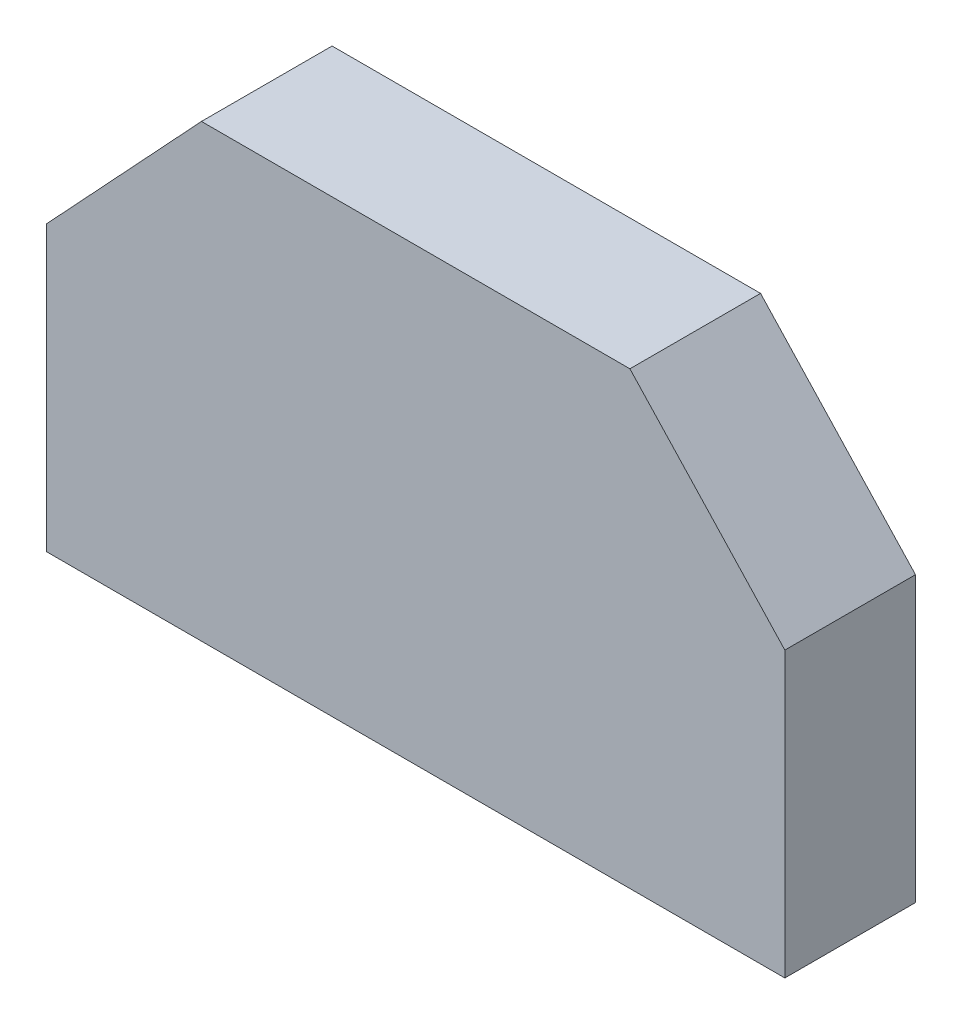
ISO-10303-21;
HEADER;
FILE_DESCRIPTION(('STEP AP214'),'2;1');
FILE_NAME('part.step','',(''),(''),'','','');
FILE_SCHEMA(('AUTOMOTIVE_DESIGN { 1 0 10303 214 1 1 1 1 }'));
ENDSEC;
DATA;
#1=APPLICATION_CONTEXT('core data for automotive mechanical design processes');
#2=APPLICATION_PROTOCOL_DEFINITION('international standard','automotive_design',2000,#1);
#3=PRODUCT_CONTEXT('',#1,'mechanical');
#4=PRODUCT('Part','Part','',(#3));
#5=PRODUCT_RELATED_PRODUCT_CATEGORY('part','',(#4));
#6=PRODUCT_DEFINITION_FORMATION('','',#4);
#7=PRODUCT_DEFINITION_CONTEXT('part definition',#1,'design');
#8=PRODUCT_DEFINITION('design','',#6,#7);
#9=PRODUCT_DEFINITION_SHAPE('','',#8);
#10=(LENGTH_UNIT() NAMED_UNIT(*) SI_UNIT(.MILLI.,.METRE.));
#11=(NAMED_UNIT(*) PLANE_ANGLE_UNIT() SI_UNIT($,.RADIAN.));
#12=(NAMED_UNIT(*) SI_UNIT($,.STERADIAN.) SOLID_ANGLE_UNIT());
#13=UNCERTAINTY_MEASURE_WITH_UNIT(LENGTH_MEASURE(1.E-05),#10,'distance_accuracy_value','');
#14=(GEOMETRIC_REPRESENTATION_CONTEXT(3) GLOBAL_UNCERTAINTY_ASSIGNED_CONTEXT((#13)) GLOBAL_UNIT_ASSIGNED_CONTEXT((#10,
#11,#12)) REPRESENTATION_CONTEXT('',''));
#15=CARTESIAN_POINT('',(0.,0.,0.));
#16=DIRECTION('',(0.,0.,1.));
#17=DIRECTION('',(1.,0.,0.));
#18=AXIS2_PLACEMENT_3D('',#15,#16,#17);
#19=CARTESIAN_POINT('',(-165.1,0.,29.21));
#20=DIRECTION('',(1.,0.,0.));
#21=DIRECTION('',(0.,0.,-1.));
#22=AXIS2_PLACEMENT_3D('',#19,#20,#21);
#23=PLANE('',#22);
#24=DIRECTION('',(0.,-1.,0.));
#25=VECTOR('',#24,1.);
#26=CARTESIAN_POINT('',(-165.1,0.,-29.21));
#27=LINE('',#26,#25);
#28=CARTESIAN_POINT('',(-165.1,127.,-29.21));
#29=VERTEX_POINT('',#28);
#30=CARTESIAN_POINT('',(-165.1,0.,-29.21));
#31=VERTEX_POINT('',#30);
#32=EDGE_CURVE('E132',#29,#31,#27,.T.);
#33=ORIENTED_EDGE('',*,*,#32,.T.);
#34=DIRECTION('',(0.,0.,-1.));
#35=VECTOR('',#34,1.);
#36=CARTESIAN_POINT('',(-165.1,0.,29.21));
#37=LINE('',#36,#35);
#38=CARTESIAN_POINT('',(-165.1,0.,29.21));
#39=VERTEX_POINT('',#38);
#40=EDGE_CURVE('E11',#39,#31,#37,.T.);
#41=ORIENTED_EDGE('',*,*,#40,.F.);
#42=DIRECTION('',(0.,-1.,0.));
#43=VECTOR('',#42,1.);
#44=CARTESIAN_POINT('',(-165.1,0.,29.21));
#45=LINE('',#44,#43);
#46=CARTESIAN_POINT('',(-165.1,127.,29.21));
#47=VERTEX_POINT('',#46);
#48=EDGE_CURVE('E148',#47,#39,#45,.T.);
#49=ORIENTED_EDGE('',*,*,#48,.F.);
#50=DIRECTION('',(0.,0.,-1.));
#51=VECTOR('',#50,1.);
#52=CARTESIAN_POINT('',(-165.1,127.,29.21));
#53=LINE('',#52,#51);
#54=EDGE_CURVE('E128',#47,#29,#53,.T.);
#55=ORIENTED_EDGE('',*,*,#54,.T.);
#56=EDGE_LOOP('',(#33,#41,#49,#55));
#57=FACE_BOUND('',#56,.T.);
#58=ADVANCED_FACE('F43',(#57),#23,.F.);
#59=CARTESIAN_POINT('',(-165.1,0.,29.21));
#60=DIRECTION('',(0.,1.,0.));
#61=DIRECTION('',(-1.,0.,0.));
#62=AXIS2_PLACEMENT_3D('',#59,#60,#61);
#63=PLANE('',#62);
#64=DIRECTION('',(1.,0.,0.));
#65=VECTOR('',#64,1.);
#66=CARTESIAN_POINT('',(-165.1,0.,-29.21));
#67=LINE('',#66,#65);
#68=CARTESIAN_POINT('',(165.1,0.,-29.21));
#69=VERTEX_POINT('',#68);
#70=EDGE_CURVE('E136',#31,#69,#67,.T.);
#71=ORIENTED_EDGE('',*,*,#70,.T.);
#72=DIRECTION('',(0.,0.,-1.));
#73=VECTOR('',#72,1.);
#74=CARTESIAN_POINT('',(165.1,0.,29.21));
#75=LINE('',#74,#73);
#76=CARTESIAN_POINT('',(165.1,0.,29.21));
#77=VERTEX_POINT('',#76);
#78=EDGE_CURVE('E52',#77,#69,#75,.T.);
#79=ORIENTED_EDGE('',*,*,#78,.F.);
#80=DIRECTION('',(1.,0.,0.));
#81=VECTOR('',#80,1.);
#82=CARTESIAN_POINT('',(-165.1,0.,29.21));
#83=LINE('',#82,#81);
#84=EDGE_CURVE('E97',#39,#77,#83,.T.);
#85=ORIENTED_EDGE('',*,*,#84,.F.);
#86=ORIENTED_EDGE('',*,*,#40,.T.);
#87=EDGE_LOOP('',(#71,#79,#85,#86));
#88=FACE_BOUND('',#87,.T.);
#89=ADVANCED_FACE('F176',(#88),#63,.F.);
#90=CARTESIAN_POINT('',(165.1,0.,29.21));
#91=DIRECTION('',(-1.,0.,0.));
#92=DIRECTION('',(0.,0.,1.));
#93=AXIS2_PLACEMENT_3D('',#90,#91,#92);
#94=PLANE('',#93);
#95=DIRECTION('',(0.,1.,0.));
#96=VECTOR('',#95,1.);
#97=CARTESIAN_POINT('',(165.1,0.,-29.21));
#98=LINE('',#97,#96);
#99=CARTESIAN_POINT('',(165.1,127.,-29.21));
#100=VERTEX_POINT('',#99);
#101=EDGE_CURVE('E139',#69,#100,#98,.T.);
#102=ORIENTED_EDGE('',*,*,#101,.T.);
#103=DIRECTION('',(0.,0.,-1.));
#104=VECTOR('',#103,1.);
#105=CARTESIAN_POINT('',(165.1,127.,29.21));
#106=LINE('',#105,#104);
#107=CARTESIAN_POINT('',(165.1,127.,29.21));
#108=VERTEX_POINT('',#107);
#109=EDGE_CURVE('E121',#108,#100,#106,.T.);
#110=ORIENTED_EDGE('',*,*,#109,.F.);
#111=DIRECTION('',(0.,1.,0.));
#112=VECTOR('',#111,1.);
#113=CARTESIAN_POINT('',(165.1,0.,29.21));
#114=LINE('',#113,#112);
#115=EDGE_CURVE('E110',#77,#108,#114,.T.);
#116=ORIENTED_EDGE('',*,*,#115,.F.);
#117=ORIENTED_EDGE('',*,*,#78,.T.);
#118=EDGE_LOOP('',(#102,#110,#116,#117));
#119=FACE_BOUND('',#118,.T.);
#120=ADVANCED_FACE('F158',(#119),#94,.F.);
#121=CARTESIAN_POINT('',(165.1,127.,29.21));
#122=DIRECTION('',(-0.731353701619169,-0.681998360062499,0.));
#123=DIRECTION('',(0.6819983600625,-0.731353701619169,0.));
#124=AXIS2_PLACEMENT_3D('',#121,#122,#123);
#125=PLANE('',#124);
#126=DIRECTION('',(-0.681998360062499,0.731353701619169,0.));
#127=VECTOR('',#126,1.);
#128=CARTESIAN_POINT('',(165.1,127.,-29.21));
#129=LINE('',#128,#127);
#130=CARTESIAN_POINT('',(95.80896661765,201.305536084508,-29.21));
#131=VERTEX_POINT('',#130);
#132=EDGE_CURVE('E119',#100,#131,#129,.T.);
#133=ORIENTED_EDGE('',*,*,#132,.T.);
#134=DIRECTION('',(0.,0.,-1.));
#135=VECTOR('',#134,1.);
#136=CARTESIAN_POINT('',(95.80896661765,201.305536084508,29.21));
#137=LINE('',#136,#135);
#138=CARTESIAN_POINT('',(95.80896661765,201.305536084508,29.21));
#139=VERTEX_POINT('',#138);
#140=EDGE_CURVE('E116',#139,#131,#137,.T.);
#141=ORIENTED_EDGE('',*,*,#140,.F.);
#142=DIRECTION('',(-0.681998360062499,0.731353701619169,0.));
#143=VECTOR('',#142,1.);
#144=CARTESIAN_POINT('',(165.1,127.,29.21));
#145=LINE('',#144,#143);
#146=EDGE_CURVE('E104',#108,#139,#145,.T.);
#147=ORIENTED_EDGE('',*,*,#146,.F.);
#148=ORIENTED_EDGE('',*,*,#109,.T.);
#149=EDGE_LOOP('',(#133,#141,#147,#148));
#150=FACE_BOUND('',#149,.T.);
#151=ADVANCED_FACE('F117',(#150),#125,.F.);
#152=CARTESIAN_POINT('',(-95.80896661765,201.305536084508,29.21));
#153=DIRECTION('',(0.,-1.,0.));
#154=DIRECTION('',(0.,0.,-1.));
#155=AXIS2_PLACEMENT_3D('',#152,#153,#154);
#156=PLANE('',#155);
#157=DIRECTION('',(-1.,0.,0.));
#158=VECTOR('',#157,1.);
#159=CARTESIAN_POINT('',(-95.80896661765,201.305536084508,-29.21));
#160=LINE('',#159,#158);
#161=CARTESIAN_POINT('',(-95.80896661765,201.305536084508,-29.21));
#162=VERTEX_POINT('',#161);
#163=EDGE_CURVE('E83',#131,#162,#160,.T.);
#164=ORIENTED_EDGE('',*,*,#163,.T.);
#165=DIRECTION('',(0.,0.,-1.));
#166=VECTOR('',#165,1.);
#167=CARTESIAN_POINT('',(-95.80896661765,201.305536084508,29.21));
#168=LINE('',#167,#166);
#169=CARTESIAN_POINT('',(-95.80896661765,201.305536084508,29.21));
#170=VERTEX_POINT('',#169);
#171=EDGE_CURVE('E122',#170,#162,#168,.T.);
#172=ORIENTED_EDGE('',*,*,#171,.F.);
#173=DIRECTION('',(-1.,0.,0.));
#174=VECTOR('',#173,1.);
#175=CARTESIAN_POINT('',(-95.80896661765,201.305536084508,29.21));
#176=LINE('',#175,#174);
#177=EDGE_CURVE('E108',#139,#170,#176,.T.);
#178=ORIENTED_EDGE('',*,*,#177,.F.);
#179=ORIENTED_EDGE('',*,*,#140,.T.);
#180=EDGE_LOOP('',(#164,#172,#178,#179));
#181=FACE_BOUND('',#180,.T.);
#182=ADVANCED_FACE('F124',(#181),#156,.F.);
#183=CARTESIAN_POINT('',(-165.1,127.,29.21));
#184=DIRECTION('',(0.731353701619169,-0.681998360062499,0.));
#185=DIRECTION('',(0.6819983600625,0.731353701619169,0.));
#186=AXIS2_PLACEMENT_3D('',#183,#184,#185);
#187=PLANE('',#186);
#188=DIRECTION('',(-0.681998360062499,-0.731353701619169,0.));
#189=VECTOR('',#188,1.);
#190=CARTESIAN_POINT('',(-165.1,127.,-29.21));
#191=LINE('',#190,#189);
#192=EDGE_CURVE('E89',#162,#29,#191,.T.);
#193=ORIENTED_EDGE('',*,*,#192,.T.);
#194=ORIENTED_EDGE('',*,*,#54,.F.);
#195=DIRECTION('',(-0.681998360062499,-0.731353701619169,0.));
#196=VECTOR('',#195,1.);
#197=CARTESIAN_POINT('',(-165.1,127.,29.21));
#198=LINE('',#197,#196);
#199=EDGE_CURVE('E60',#170,#47,#198,.T.);
#200=ORIENTED_EDGE('',*,*,#199,.F.);
#201=ORIENTED_EDGE('',*,*,#171,.T.);
#202=EDGE_LOOP('',(#193,#194,#200,#201));
#203=FACE_BOUND('',#202,.T.);
#204=ADVANCED_FACE('F165',(#203),#187,.F.);
#205=CARTESIAN_POINT('',(0.,0.,29.21));
#206=DIRECTION('',(0.,0.,-1.));
#207=DIRECTION('',(-1.,0.,0.));
#208=AXIS2_PLACEMENT_3D('',#205,#206,#207);
#209=PLANE('',#208);
#210=ORIENTED_EDGE('',*,*,#48,.T.);
#211=ORIENTED_EDGE('',*,*,#84,.T.);
#212=ORIENTED_EDGE('',*,*,#115,.T.);
#213=ORIENTED_EDGE('',*,*,#146,.T.);
#214=ORIENTED_EDGE('',*,*,#177,.T.);
#215=ORIENTED_EDGE('',*,*,#199,.T.);
#216=EDGE_LOOP('',(#210,#211,#212,#213,#214,#215));
#217=FACE_BOUND('',#216,.T.);
#218=ADVANCED_FACE('F106',(#217),#209,.F.);
#219=CARTESIAN_POINT('',(0.,0.,-29.21));
#220=DIRECTION('',(0.,0.,-1.));
#221=DIRECTION('',(-1.,0.,0.));
#222=AXIS2_PLACEMENT_3D('',#219,#220,#221);
#223=PLANE('',#222);
#224=ORIENTED_EDGE('',*,*,#32,.F.);
#225=ORIENTED_EDGE('',*,*,#192,.F.);
#226=ORIENTED_EDGE('',*,*,#163,.F.);
#227=ORIENTED_EDGE('',*,*,#132,.F.);
#228=ORIENTED_EDGE('',*,*,#101,.F.);
#229=ORIENTED_EDGE('',*,*,#70,.F.);
#230=EDGE_LOOP('',(#224,#225,#226,#227,#228,#229));
#231=FACE_BOUND('',#230,.T.);
#232=ADVANCED_FACE('F161',(#231),#223,.T.);
#233=CLOSED_SHELL('',(#58,#89,#120,#151,#182,#204,#218,#232));
#234=MANIFOLD_SOLID_BREP('B2',#233);
#235=ADVANCED_BREP_SHAPE_REPRESENTATION('',(#18,#234),#14);
#236=SHAPE_DEFINITION_REPRESENTATION(#9,#235);
ENDSEC;
END-ISO-10303-21;
